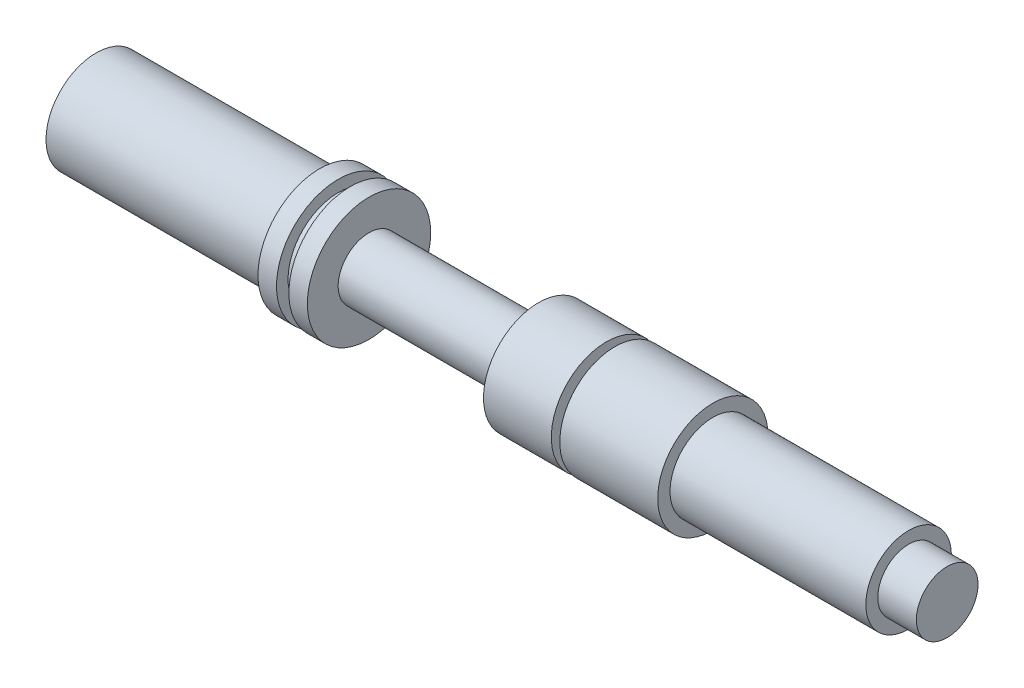
ISO-10303-21;
HEADER;
FILE_DESCRIPTION(('STEP AP214'),'2;1');
FILE_NAME('part.step','',(''),(''),'','','');
FILE_SCHEMA(('AUTOMOTIVE_DESIGN { 1 0 10303 214 1 1 1 1 }'));
ENDSEC;
DATA;
#1=APPLICATION_CONTEXT('core data for automotive mechanical design processes');
#2=APPLICATION_PROTOCOL_DEFINITION('international standard','automotive_design',2000,#1);
#3=PRODUCT_CONTEXT('',#1,'mechanical');
#4=PRODUCT('Part','Part','',(#3));
#5=PRODUCT_RELATED_PRODUCT_CATEGORY('part','',(#4));
#6=PRODUCT_DEFINITION_FORMATION('','',#4);
#7=PRODUCT_DEFINITION_CONTEXT('part definition',#1,'design');
#8=PRODUCT_DEFINITION('design','',#6,#7);
#9=PRODUCT_DEFINITION_SHAPE('','',#8);
#10=(LENGTH_UNIT() NAMED_UNIT(*) SI_UNIT(.MILLI.,.METRE.));
#11=(NAMED_UNIT(*) PLANE_ANGLE_UNIT() SI_UNIT($,.RADIAN.));
#12=(NAMED_UNIT(*) SI_UNIT($,.STERADIAN.) SOLID_ANGLE_UNIT());
#13=UNCERTAINTY_MEASURE_WITH_UNIT(LENGTH_MEASURE(1.E-05),#10,'distance_accuracy_value','');
#14=(GEOMETRIC_REPRESENTATION_CONTEXT(3) GLOBAL_UNCERTAINTY_ASSIGNED_CONTEXT((#13)) GLOBAL_UNIT_ASSIGNED_CONTEXT((#10,
#11,#12)) REPRESENTATION_CONTEXT('',''));
#15=CARTESIAN_POINT('',(0.,0.,0.));
#16=DIRECTION('',(0.,0.,1.));
#17=DIRECTION('',(1.,0.,0.));
#18=AXIS2_PLACEMENT_3D('',#15,#16,#17);
#19=CARTESIAN_POINT('',(105.4,0.,0.));
#20=DIRECTION('',(1.,0.,0.));
#21=DIRECTION('',(0.,0.,-1.));
#22=AXIS2_PLACEMENT_3D('',#19,#20,#21);
#23=PLANE('',#22);
#24=CARTESIAN_POINT('',(105.4,0.,0.));
#25=DIRECTION('',(1.,0.,0.));
#26=DIRECTION('',(0.,0.,-1.));
#27=AXIS2_PLACEMENT_3D('',#24,#25,#26);
#28=CIRCLE('',#27,5.55);
#29=CARTESIAN_POINT('',(105.4,0.,-5.55));
#30=VERTEX_POINT('',#29);
#31=EDGE_CURVE('E84',#30,#30,#28,.T.);
#32=ORIENTED_EDGE('',*,*,#31,.T.);
#33=EDGE_LOOP('',(#32));
#34=FACE_BOUND('',#33,.T.);
#35=CARTESIAN_POINT('',(105.4,0.,0.));
#36=DIRECTION('',(1.,0.,0.));
#37=DIRECTION('',(0.,0.,-1.));
#38=AXIS2_PLACEMENT_3D('',#35,#36,#37);
#39=CIRCLE('',#38,4.);
#40=CARTESIAN_POINT('',(105.4,0.,-4.));
#41=VERTEX_POINT('',#40);
#42=EDGE_CURVE('E93',#41,#41,#39,.T.);
#43=ORIENTED_EDGE('',*,*,#42,.F.);
#44=EDGE_LOOP('',(#43));
#45=FACE_BOUND('',#44,.T.);
#46=ADVANCED_FACE('F32',(#34,#45),#23,.T.);
#47=CARTESIAN_POINT('',(80.,0.,0.));
#48=DIRECTION('',(1.,0.,0.));
#49=DIRECTION('',(0.,0.,-1.));
#50=AXIS2_PLACEMENT_3D('',#47,#48,#49);
#51=PLANE('',#50);
#52=CARTESIAN_POINT('',(80.,0.,0.));
#53=DIRECTION('',(1.,0.,0.));
#54=DIRECTION('',(0.,0.,-1.));
#55=AXIS2_PLACEMENT_3D('',#52,#53,#54);
#56=CIRCLE('',#55,7.15);
#57=CARTESIAN_POINT('',(80.,0.,-7.15));
#58=VERTEX_POINT('',#57);
#59=EDGE_CURVE('E78',#58,#58,#56,.T.);
#60=ORIENTED_EDGE('',*,*,#59,.T.);
#61=EDGE_LOOP('',(#60));
#62=FACE_BOUND('',#61,.T.);
#63=CARTESIAN_POINT('',(80.,0.,0.));
#64=DIRECTION('',(1.,0.,0.));
#65=DIRECTION('',(0.,0.,-1.));
#66=AXIS2_PLACEMENT_3D('',#63,#64,#65);
#67=CIRCLE('',#66,5.55);
#68=CARTESIAN_POINT('',(80.,0.,-5.55));
#69=VERTEX_POINT('',#68);
#70=EDGE_CURVE('E87',#69,#69,#67,.T.);
#71=ORIENTED_EDGE('',*,*,#70,.F.);
#72=EDGE_LOOP('',(#71));
#73=FACE_BOUND('',#72,.T.);
#74=ADVANCED_FACE('F109',(#62,#73),#51,.T.);
#75=CARTESIAN_POINT('',(66.2,0.,0.));
#76=DIRECTION('',(1.,0.,0.));
#77=DIRECTION('',(0.,0.,-1.));
#78=AXIS2_PLACEMENT_3D('',#75,#76,#77);
#79=PLANE('',#78);
#80=CARTESIAN_POINT('',(66.2,0.,0.));
#81=DIRECTION('',(1.,0.,0.));
#82=DIRECTION('',(0.,0.,-1.));
#83=AXIS2_PLACEMENT_3D('',#80,#81,#82);
#84=CIRCLE('',#83,7.15);
#85=CARTESIAN_POINT('',(66.2,0.,-7.15));
#86=VERTEX_POINT('',#85);
#87=EDGE_CURVE('E66',#86,#86,#84,.T.);
#88=ORIENTED_EDGE('',*,*,#87,.T.);
#89=EDGE_LOOP('',(#88));
#90=FACE_BOUND('',#89,.T.);
#91=CARTESIAN_POINT('',(66.2,0.,0.));
#92=DIRECTION('',(1.,0.,0.));
#93=DIRECTION('',(0.,0.,-1.));
#94=AXIS2_PLACEMENT_3D('',#91,#92,#93);
#95=CIRCLE('',#94,5.55);
#96=CARTESIAN_POINT('',(66.2,0.,-5.55));
#97=VERTEX_POINT('',#96);
#98=EDGE_CURVE('E75',#97,#97,#95,.T.);
#99=ORIENTED_EDGE('',*,*,#98,.F.);
#100=EDGE_LOOP('',(#99));
#101=FACE_BOUND('',#100,.T.);
#102=ADVANCED_FACE('F115',(#90,#101),#79,.T.);
#103=CARTESIAN_POINT('',(35.4,0.,0.));
#104=DIRECTION('',(1.,0.,0.));
#105=DIRECTION('',(0.,0.,-1.));
#106=AXIS2_PLACEMENT_3D('',#103,#104,#105);
#107=PLANE('',#106);
#108=CARTESIAN_POINT('',(35.4,0.,0.));
#109=DIRECTION('',(1.,0.,0.));
#110=DIRECTION('',(0.,0.,-1.));
#111=AXIS2_PLACEMENT_3D('',#108,#109,#110);
#112=CIRCLE('',#111,8.);
#113=CARTESIAN_POINT('',(35.4,0.,-8.));
#114=VERTEX_POINT('',#113);
#115=EDGE_CURVE('E54',#114,#114,#112,.T.);
#116=ORIENTED_EDGE('',*,*,#115,.T.);
#117=EDGE_LOOP('',(#116));
#118=FACE_BOUND('',#117,.T.);
#119=CARTESIAN_POINT('',(35.4,0.,0.));
#120=DIRECTION('',(1.,0.,0.));
#121=DIRECTION('',(0.,0.,-1.));
#122=AXIS2_PLACEMENT_3D('',#119,#120,#121);
#123=CIRCLE('',#122,4.);
#124=CARTESIAN_POINT('',(35.4,0.,-4.));
#125=VERTEX_POINT('',#124);
#126=EDGE_CURVE('E63',#125,#125,#123,.T.);
#127=ORIENTED_EDGE('',*,*,#126,.F.);
#128=EDGE_LOOP('',(#127));
#129=FACE_BOUND('',#128,.T.);
#130=ADVANCED_FACE('F138',(#118,#129),#107,.T.);
#131=CARTESIAN_POINT('',(31.4,0.,0.));
#132=DIRECTION('',(1.,0.,0.));
#133=DIRECTION('',(0.,0.,-1.));
#134=AXIS2_PLACEMENT_3D('',#131,#132,#133);
#135=PLANE('',#134);
#136=CARTESIAN_POINT('',(31.4,0.,0.));
#137=DIRECTION('',(1.,0.,0.));
#138=DIRECTION('',(0.,0.,-1.));
#139=AXIS2_PLACEMENT_3D('',#136,#137,#138);
#140=CIRCLE('',#139,8.);
#141=CARTESIAN_POINT('',(31.4,0.,-8.));
#142=VERTEX_POINT('',#141);
#143=EDGE_CURVE('E43',#142,#142,#140,.T.);
#144=ORIENTED_EDGE('',*,*,#143,.T.);
#145=EDGE_LOOP('',(#144));
#146=FACE_BOUND('',#145,.T.);
#147=CARTESIAN_POINT('',(31.4,0.,0.));
#148=DIRECTION('',(1.,0.,0.));
#149=DIRECTION('',(0.,0.,-1.));
#150=AXIS2_PLACEMENT_3D('',#147,#148,#149);
#151=CIRCLE('',#150,6.5);
#152=CARTESIAN_POINT('',(31.4,0.,-6.5));
#153=VERTEX_POINT('',#152);
#154=EDGE_CURVE('E51',#153,#153,#151,.T.);
#155=ORIENTED_EDGE('',*,*,#154,.F.);
#156=EDGE_LOOP('',(#155));
#157=FACE_BOUND('',#156,.T.);
#158=ADVANCED_FACE('F154',(#146,#157),#135,.T.);
#159=CARTESIAN_POINT('',(29.,0.,0.));
#160=DIRECTION('',(-1.,0.,0.));
#161=DIRECTION('',(0.,0.,1.));
#162=AXIS2_PLACEMENT_3D('',#159,#160,#161);
#163=CYLINDRICAL_SURFACE('',#162,6.5);
#164=CARTESIAN_POINT('',(29.,0.,0.));
#165=DIRECTION('',(1.,0.,0.));
#166=DIRECTION('',(0.,0.,-1.));
#167=AXIS2_PLACEMENT_3D('',#164,#165,#166);
#168=CIRCLE('',#167,6.5);
#169=CARTESIAN_POINT('',(29.,0.,6.5));
#170=VERTEX_POINT('',#169);
#171=EDGE_CURVE('E10',#170,#170,#168,.T.);
#172=CARTESIAN_POINT('',(0.,0.,0.));
#173=DIRECTION('',(1.,0.,0.));
#174=DIRECTION('',(0.,0.,-1.));
#175=AXIS2_PLACEMENT_3D('',#172,#173,#174);
#176=CIRCLE('',#175,6.5);
#177=CARTESIAN_POINT('',(0.,0.,6.5));
#178=VERTEX_POINT('',#177);
#179=EDGE_CURVE('E36',#178,#178,#176,.T.);
#180=CARTESIAN_POINT('',(29.,0.,6.5));
#181=CARTESIAN_POINT('',(28.6979166666667,0.,6.5));
#182=CARTESIAN_POINT('',(28.3958333333333,0.,6.5));
#183=CARTESIAN_POINT('',(27.7916666666667,0.,6.5));
#184=CARTESIAN_POINT('',(27.4895833333333,0.,6.5));
#185=CARTESIAN_POINT('',(26.8854166666667,0.,6.5));
#186=CARTESIAN_POINT('',(26.5833333333333,0.,6.5));
#187=CARTESIAN_POINT('',(25.9791666666667,0.,6.5));
#188=CARTESIAN_POINT('',(25.6770833333333,0.,6.5));
#189=CARTESIAN_POINT('',(25.0729166666667,0.,6.5));
#190=CARTESIAN_POINT('',(24.7708333333333,0.,6.5));
#191=CARTESIAN_POINT('',(24.1666666666667,0.,6.5));
#192=CARTESIAN_POINT('',(23.8645833333333,0.,6.5));
#193=CARTESIAN_POINT('',(23.2604166666667,0.,6.5));
#194=CARTESIAN_POINT('',(22.9583333333333,0.,6.5));
#195=CARTESIAN_POINT('',(22.3541666666667,0.,6.5));
#196=CARTESIAN_POINT('',(22.0520833333333,0.,6.5));
#197=CARTESIAN_POINT('',(21.4479166666667,0.,6.5));
#198=CARTESIAN_POINT('',(21.1458333333333,0.,6.5));
#199=CARTESIAN_POINT('',(20.5416666666667,0.,6.5));
#200=CARTESIAN_POINT('',(20.2395833333333,0.,6.5));
#201=CARTESIAN_POINT('',(19.6354166666667,0.,6.5));
#202=CARTESIAN_POINT('',(19.3333333333333,0.,6.5));
#203=CARTESIAN_POINT('',(18.7291666666667,0.,6.5));
#204=CARTESIAN_POINT('',(18.4270833333333,0.,6.5));
#205=CARTESIAN_POINT('',(17.8229166666667,0.,6.5));
#206=CARTESIAN_POINT('',(17.5208333333333,0.,6.5));
#207=CARTESIAN_POINT('',(16.9166666666667,0.,6.5));
#208=CARTESIAN_POINT('',(16.6145833333333,0.,6.5));
#209=CARTESIAN_POINT('',(16.0104166666667,0.,6.5));
#210=CARTESIAN_POINT('',(15.7083333333333,0.,6.5));
#211=CARTESIAN_POINT('',(15.1041666666667,0.,6.5));
#212=CARTESIAN_POINT('',(14.8020833333333,0.,6.5));
#213=CARTESIAN_POINT('',(14.1979166666667,0.,6.5));
#214=CARTESIAN_POINT('',(13.8958333333333,0.,6.5));
#215=CARTESIAN_POINT('',(13.2916666666667,0.,6.5));
#216=CARTESIAN_POINT('',(12.9895833333333,0.,6.5));
#217=CARTESIAN_POINT('',(12.3854166666667,0.,6.5));
#218=CARTESIAN_POINT('',(12.0833333333333,0.,6.5));
#219=CARTESIAN_POINT('',(11.4791666666667,0.,6.5));
#220=CARTESIAN_POINT('',(11.1770833333333,0.,6.5));
#221=CARTESIAN_POINT('',(10.5729166666667,0.,6.5));
#222=CARTESIAN_POINT('',(10.2708333333333,0.,6.5));
#223=CARTESIAN_POINT('',(9.66666666666667,0.,6.5));
#224=CARTESIAN_POINT('',(9.36458333333333,0.,6.5));
#225=CARTESIAN_POINT('',(8.76041666666667,0.,6.5));
#226=CARTESIAN_POINT('',(8.45833333333333,0.,6.5));
#227=CARTESIAN_POINT('',(7.85416666666667,0.,6.5));
#228=CARTESIAN_POINT('',(7.55208333333333,0.,6.5));
#229=CARTESIAN_POINT('',(6.94791666666667,0.,6.5));
#230=CARTESIAN_POINT('',(6.64583333333333,0.,6.5));
#231=CARTESIAN_POINT('',(6.04166666666667,0.,6.5));
#232=CARTESIAN_POINT('',(5.73958333333333,0.,6.5));
#233=CARTESIAN_POINT('',(5.13541666666667,0.,6.5));
#234=CARTESIAN_POINT('',(4.83333333333333,0.,6.5));
#235=CARTESIAN_POINT('',(4.22916666666667,0.,6.5));
#236=CARTESIAN_POINT('',(3.92708333333333,0.,6.5));
#237=CARTESIAN_POINT('',(3.32291666666667,0.,6.5));
#238=CARTESIAN_POINT('',(3.02083333333333,0.,6.5));
#239=CARTESIAN_POINT('',(2.41666666666667,0.,6.5));
#240=CARTESIAN_POINT('',(2.11458333333333,0.,6.5));
#241=CARTESIAN_POINT('',(1.51041666666667,0.,6.5));
#242=CARTESIAN_POINT('',(1.20833333333333,0.,6.5));
#243=CARTESIAN_POINT('',(0.604166666666667,0.,6.5));
#244=CARTESIAN_POINT('',(0.302083333333333,0.,6.5));
#245=CARTESIAN_POINT('',(0.,0.,6.5));
#246=B_SPLINE_CURVE_WITH_KNOTS('',3,(#180,#181,#182,#183,#184,#185,#186,#187,#188,#189,#190,
#191,#192,#193,#194,#195,#196,#197,#198,#199,#200,#201,#202,#203,#204,#205,#206,#207,#208,#209,
#210,#211,#212,#213,#214,#215,#216,#217,#218,#219,#220,#221,#222,#223,#224,#225,#226,#227,#228,
#229,#230,#231,#232,#233,#234,#235,#236,#237,#238,#239,#240,#241,#242,#243,#244,#245),
.UNSPECIFIED.,.F.,.F.,(4,2,2,2,2,2,2,2,2,2,2,2,2,2,2,2,2,2,2,2,2,2,2,2,2,2,2,2,2,2,2,2,4),(0.,
0.906250000000001,1.8125,2.71875,3.625,4.53125,5.4375,6.34375,7.25,8.15625,9.0625,9.96875,
10.875,11.78125,12.6875,13.59375,14.5,15.40625,16.3125,17.21875,18.125,19.03125,19.9375,
20.84375,21.75,22.65625,23.5625,24.46875,25.375,26.28125,27.1875,28.09375,29.),.UNSPECIFIED.);
#247=EDGE_CURVE('BSEAM34',#170,#178,#246,.T.);
#248=ORIENTED_EDGE('',*,*,#171,.F.);
#249=ORIENTED_EDGE('',*,*,#179,.T.);
#250=ORIENTED_EDGE('',*,*,#247,.T.);
#251=ORIENTED_EDGE('',*,*,#247,.F.);
#252=EDGE_LOOP('',(#248,#250,#249,#251));
#253=FACE_BOUND('',#252,.T.);
#254=ADVANCED_FACE('F34',(#253),#163,.T.);
#255=CARTESIAN_POINT('',(0.,0.,0.));
#256=DIRECTION('',(1.,0.,0.));
#257=DIRECTION('',(0.,0.,-1.));
#258=AXIS2_PLACEMENT_3D('',#255,#256,#257);
#259=PLANE('',#258);
#260=ORIENTED_EDGE('',*,*,#179,.F.);
#261=EDGE_LOOP('',(#260));
#262=FACE_BOUND('',#261,.T.);
#263=ADVANCED_FACE('F174',(#262),#259,.F.);
#264=CARTESIAN_POINT('',(29.,0.,0.));
#265=DIRECTION('',(1.,0.,0.));
#266=DIRECTION('',(0.,0.,-1.));
#267=AXIS2_PLACEMENT_3D('',#264,#265,#266);
#268=PLANE('',#267);
#269=CARTESIAN_POINT('',(29.,0.,0.));
#270=DIRECTION('',(1.,0.,0.));
#271=DIRECTION('',(0.,0.,-1.));
#272=AXIS2_PLACEMENT_3D('',#269,#270,#271);
#273=CIRCLE('',#272,8.);
#274=CARTESIAN_POINT('',(29.,0.,-8.));
#275=VERTEX_POINT('',#274);
#276=EDGE_CURVE('E45',#275,#275,#273,.T.);
#277=ORIENTED_EDGE('',*,*,#276,.F.);
#278=EDGE_LOOP('',(#277));
#279=FACE_BOUND('',#278,.T.);
#280=ORIENTED_EDGE('',*,*,#171,.T.);
#281=EDGE_LOOP('',(#280));
#282=FACE_BOUND('',#281,.T.);
#283=ADVANCED_FACE('F171',(#279,#282),#268,.F.);
#284=CARTESIAN_POINT('',(31.4,0.,0.));
#285=DIRECTION('',(-1.,0.,0.));
#286=DIRECTION('',(0.,0.,1.));
#287=AXIS2_PLACEMENT_3D('',#284,#285,#286);
#288=CYLINDRICAL_SURFACE('',#287,8.);
#289=ORIENTED_EDGE('',*,*,#143,.F.);
#290=EDGE_LOOP('',(#289));
#291=FACE_BOUND('',#290,.T.);
#292=ORIENTED_EDGE('',*,*,#276,.T.);
#293=EDGE_LOOP('',(#292));
#294=FACE_BOUND('',#293,.T.);
#295=ADVANCED_FACE('F166',(#291,#294),#288,.T.);
#296=CARTESIAN_POINT('',(33.,0.,0.));
#297=DIRECTION('',(-1.,0.,0.));
#298=DIRECTION('',(0.,0.,1.));
#299=AXIS2_PLACEMENT_3D('',#296,#297,#298);
#300=CYLINDRICAL_SURFACE('',#299,6.5);
#301=CARTESIAN_POINT('',(33.,0.,0.));
#302=DIRECTION('',(1.,0.,0.));
#303=DIRECTION('',(0.,0.,-1.));
#304=AXIS2_PLACEMENT_3D('',#301,#302,#303);
#305=CIRCLE('',#304,6.5);
#306=CARTESIAN_POINT('',(33.,0.,-6.5));
#307=VERTEX_POINT('',#306);
#308=EDGE_CURVE('E48',#307,#307,#305,.T.);
#309=ORIENTED_EDGE('',*,*,#308,.F.);
#310=EDGE_LOOP('',(#309));
#311=FACE_BOUND('',#310,.T.);
#312=ORIENTED_EDGE('',*,*,#154,.T.);
#313=EDGE_LOOP('',(#312));
#314=FACE_BOUND('',#313,.T.);
#315=ADVANCED_FACE('F159',(#311,#314),#300,.T.);
#316=CARTESIAN_POINT('',(33.,0.,0.));
#317=DIRECTION('',(1.,0.,0.));
#318=DIRECTION('',(0.,0.,-1.));
#319=AXIS2_PLACEMENT_3D('',#316,#317,#318);
#320=PLANE('',#319);
#321=CARTESIAN_POINT('',(33.,0.,0.));
#322=DIRECTION('',(1.,0.,0.));
#323=DIRECTION('',(0.,0.,-1.));
#324=AXIS2_PLACEMENT_3D('',#321,#322,#323);
#325=CIRCLE('',#324,8.);
#326=CARTESIAN_POINT('',(33.,0.,-8.));
#327=VERTEX_POINT('',#326);
#328=EDGE_CURVE('E57',#327,#327,#325,.T.);
#329=ORIENTED_EDGE('',*,*,#328,.F.);
#330=EDGE_LOOP('',(#329));
#331=FACE_BOUND('',#330,.T.);
#332=ORIENTED_EDGE('',*,*,#308,.T.);
#333=EDGE_LOOP('',(#332));
#334=FACE_BOUND('',#333,.T.);
#335=ADVANCED_FACE('F156',(#331,#334),#320,.F.);
#336=CARTESIAN_POINT('',(35.4,0.,0.));
#337=DIRECTION('',(-1.,0.,0.));
#338=DIRECTION('',(0.,0.,1.));
#339=AXIS2_PLACEMENT_3D('',#336,#337,#338);
#340=CYLINDRICAL_SURFACE('',#339,8.);
#341=ORIENTED_EDGE('',*,*,#115,.F.);
#342=EDGE_LOOP('',(#341));
#343=FACE_BOUND('',#342,.T.);
#344=ORIENTED_EDGE('',*,*,#328,.T.);
#345=EDGE_LOOP('',(#344));
#346=FACE_BOUND('',#345,.T.);
#347=ADVANCED_FACE('F150',(#343,#346),#340,.T.);
#348=CARTESIAN_POINT('',(57.4,0.,0.));
#349=DIRECTION('',(-1.,0.,0.));
#350=DIRECTION('',(0.,0.,1.));
#351=AXIS2_PLACEMENT_3D('',#348,#349,#350);
#352=CYLINDRICAL_SURFACE('',#351,4.);
#353=CARTESIAN_POINT('',(57.4,0.,0.));
#354=DIRECTION('',(1.,0.,0.));
#355=DIRECTION('',(0.,0.,-1.));
#356=AXIS2_PLACEMENT_3D('',#353,#354,#355);
#357=CIRCLE('',#356,4.);
#358=CARTESIAN_POINT('',(57.4,0.,-4.));
#359=VERTEX_POINT('',#358);
#360=EDGE_CURVE('E60',#359,#359,#357,.T.);
#361=ORIENTED_EDGE('',*,*,#360,.F.);
#362=EDGE_LOOP('',(#361));
#363=FACE_BOUND('',#362,.T.);
#364=ORIENTED_EDGE('',*,*,#126,.T.);
#365=EDGE_LOOP('',(#364));
#366=FACE_BOUND('',#365,.T.);
#367=ADVANCED_FACE('F143',(#363,#366),#352,.T.);
#368=CARTESIAN_POINT('',(57.4,0.,0.));
#369=DIRECTION('',(1.,0.,0.));
#370=DIRECTION('',(0.,0.,-1.));
#371=AXIS2_PLACEMENT_3D('',#368,#369,#370);
#372=PLANE('',#371);
#373=CARTESIAN_POINT('',(57.4,0.,0.));
#374=DIRECTION('',(1.,0.,0.));
#375=DIRECTION('',(0.,0.,-1.));
#376=AXIS2_PLACEMENT_3D('',#373,#374,#375);
#377=CIRCLE('',#376,7.15);
#378=CARTESIAN_POINT('',(57.4,0.,-7.15));
#379=VERTEX_POINT('',#378);
#380=EDGE_CURVE('E69',#379,#379,#377,.T.);
#381=ORIENTED_EDGE('',*,*,#380,.F.);
#382=EDGE_LOOP('',(#381));
#383=FACE_BOUND('',#382,.T.);
#384=ORIENTED_EDGE('',*,*,#360,.T.);
#385=EDGE_LOOP('',(#384));
#386=FACE_BOUND('',#385,.T.);
#387=ADVANCED_FACE('F140',(#383,#386),#372,.F.);
#388=CARTESIAN_POINT('',(66.2,0.,0.));
#389=DIRECTION('',(-1.,0.,0.));
#390=DIRECTION('',(0.,0.,1.));
#391=AXIS2_PLACEMENT_3D('',#388,#389,#390);
#392=CYLINDRICAL_SURFACE('',#391,7.15);
#393=ORIENTED_EDGE('',*,*,#87,.F.);
#394=EDGE_LOOP('',(#393));
#395=FACE_BOUND('',#394,.T.);
#396=ORIENTED_EDGE('',*,*,#380,.T.);
#397=EDGE_LOOP('',(#396));
#398=FACE_BOUND('',#397,.T.);
#399=ADVANCED_FACE('F134',(#395,#398),#392,.T.);
#400=CARTESIAN_POINT('',(67.3,0.,0.));
#401=DIRECTION('',(-1.,0.,0.));
#402=DIRECTION('',(0.,0.,1.));
#403=AXIS2_PLACEMENT_3D('',#400,#401,#402);
#404=CYLINDRICAL_SURFACE('',#403,5.55);
#405=CARTESIAN_POINT('',(67.3,0.,0.));
#406=DIRECTION('',(1.,0.,0.));
#407=DIRECTION('',(0.,0.,-1.));
#408=AXIS2_PLACEMENT_3D('',#405,#406,#407);
#409=CIRCLE('',#408,5.55);
#410=CARTESIAN_POINT('',(67.3,0.,-5.55));
#411=VERTEX_POINT('',#410);
#412=EDGE_CURVE('E72',#411,#411,#409,.T.);
#413=ORIENTED_EDGE('',*,*,#412,.F.);
#414=EDGE_LOOP('',(#413));
#415=FACE_BOUND('',#414,.T.);
#416=ORIENTED_EDGE('',*,*,#98,.T.);
#417=EDGE_LOOP('',(#416));
#418=FACE_BOUND('',#417,.T.);
#419=ADVANCED_FACE('F127',(#415,#418),#404,.T.);
#420=CARTESIAN_POINT('',(67.3,0.,0.));
#421=DIRECTION('',(1.,0.,0.));
#422=DIRECTION('',(0.,0.,-1.));
#423=AXIS2_PLACEMENT_3D('',#420,#421,#422);
#424=PLANE('',#423);
#425=CARTESIAN_POINT('',(67.3,0.,0.));
#426=DIRECTION('',(1.,0.,0.));
#427=DIRECTION('',(0.,0.,-1.));
#428=AXIS2_PLACEMENT_3D('',#425,#426,#427);
#429=CIRCLE('',#428,7.15);
#430=CARTESIAN_POINT('',(67.3,0.,-7.15));
#431=VERTEX_POINT('',#430);
#432=EDGE_CURVE('E81',#431,#431,#429,.T.);
#433=ORIENTED_EDGE('',*,*,#432,.F.);
#434=EDGE_LOOP('',(#433));
#435=FACE_BOUND('',#434,.T.);
#436=ORIENTED_EDGE('',*,*,#412,.T.);
#437=EDGE_LOOP('',(#436));
#438=FACE_BOUND('',#437,.T.);
#439=ADVANCED_FACE('F124',(#435,#438),#424,.F.);
#440=CARTESIAN_POINT('',(80.,0.,0.));
#441=DIRECTION('',(-1.,0.,0.));
#442=DIRECTION('',(0.,0.,1.));
#443=AXIS2_PLACEMENT_3D('',#440,#441,#442);
#444=CYLINDRICAL_SURFACE('',#443,7.15);
#445=ORIENTED_EDGE('',*,*,#59,.F.);
#446=EDGE_LOOP('',(#445));
#447=FACE_BOUND('',#446,.T.);
#448=ORIENTED_EDGE('',*,*,#432,.T.);
#449=EDGE_LOOP('',(#448));
#450=FACE_BOUND('',#449,.T.);
#451=ADVANCED_FACE('F121',(#447,#450),#444,.T.);
#452=CARTESIAN_POINT('',(105.4,0.,0.));
#453=DIRECTION('',(-1.,0.,0.));
#454=DIRECTION('',(0.,0.,1.));
#455=AXIS2_PLACEMENT_3D('',#452,#453,#454);
#456=CYLINDRICAL_SURFACE('',#455,5.55);
#457=ORIENTED_EDGE('',*,*,#31,.F.);
#458=EDGE_LOOP('',(#457));
#459=FACE_BOUND('',#458,.T.);
#460=ORIENTED_EDGE('',*,*,#70,.T.);
#461=EDGE_LOOP('',(#460));
#462=FACE_BOUND('',#461,.T.);
#463=ADVANCED_FACE('F104',(#459,#462),#456,.T.);
#464=CARTESIAN_POINT('',(110.4,0.,0.));
#465=DIRECTION('',(-1.,0.,0.));
#466=DIRECTION('',(0.,0.,1.));
#467=AXIS2_PLACEMENT_3D('',#464,#465,#466);
#468=CYLINDRICAL_SURFACE('',#467,4.);
#469=CARTESIAN_POINT('',(110.4,0.,0.));
#470=DIRECTION('',(1.,0.,0.));
#471=DIRECTION('',(0.,0.,-1.));
#472=AXIS2_PLACEMENT_3D('',#469,#470,#471);
#473=CIRCLE('',#472,4.);
#474=CARTESIAN_POINT('',(110.4,0.,-4.));
#475=VERTEX_POINT('',#474);
#476=EDGE_CURVE('E90',#475,#475,#473,.T.);
#477=ORIENTED_EDGE('',*,*,#476,.F.);
#478=EDGE_LOOP('',(#477));
#479=FACE_BOUND('',#478,.T.);
#480=ORIENTED_EDGE('',*,*,#42,.T.);
#481=EDGE_LOOP('',(#480));
#482=FACE_BOUND('',#481,.T.);
#483=ADVANCED_FACE('F101',(#479,#482),#468,.T.);
#484=CARTESIAN_POINT('',(110.4,0.,0.));
#485=DIRECTION('',(1.,0.,0.));
#486=DIRECTION('',(0.,0.,-1.));
#487=AXIS2_PLACEMENT_3D('',#484,#485,#486);
#488=PLANE('',#487);
#489=ORIENTED_EDGE('',*,*,#476,.T.);
#490=EDGE_LOOP('',(#489));
#491=FACE_BOUND('',#490,.T.);
#492=ADVANCED_FACE('F99',(#491),#488,.T.);
#493=CLOSED_SHELL('',(#46,#74,#102,#130,#158,#254,#263,#283,#295,#315,#335,#347,#367,#387,#399,
#419,#439,#451,#463,#483,#492));
#494=MANIFOLD_SOLID_BREP('B2',#493);
#495=ADVANCED_BREP_SHAPE_REPRESENTATION('',(#18,#494),#14);
#496=SHAPE_DEFINITION_REPRESENTATION(#9,#495);
ENDSEC;
END-ISO-10303-21;
